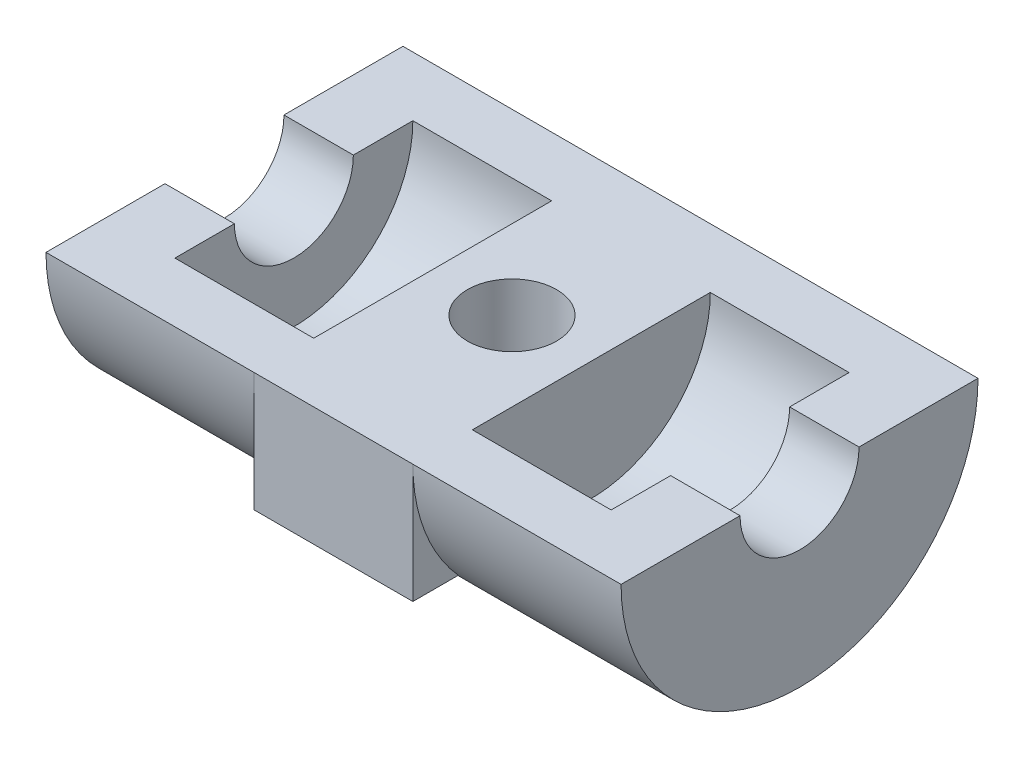
ISO-10303-21;
HEADER;
FILE_DESCRIPTION(('STEP AP214'),'2;1');
FILE_NAME('part.step','',(''),(''),'','','');
FILE_SCHEMA(('AUTOMOTIVE_DESIGN { 1 0 10303 214 1 1 1 1 }'));
ENDSEC;
DATA;
#1=APPLICATION_CONTEXT('core data for automotive mechanical design processes');
#2=APPLICATION_PROTOCOL_DEFINITION('international standard','automotive_design',2000,#1);
#3=PRODUCT_CONTEXT('',#1,'mechanical');
#4=PRODUCT('Part','Part','',(#3));
#5=PRODUCT_RELATED_PRODUCT_CATEGORY('part','',(#4));
#6=PRODUCT_DEFINITION_FORMATION('','',#4);
#7=PRODUCT_DEFINITION_CONTEXT('part definition',#1,'design');
#8=PRODUCT_DEFINITION('design','',#6,#7);
#9=PRODUCT_DEFINITION_SHAPE('','',#8);
#10=(LENGTH_UNIT() NAMED_UNIT(*) SI_UNIT(.MILLI.,.METRE.));
#11=(NAMED_UNIT(*) PLANE_ANGLE_UNIT() SI_UNIT($,.RADIAN.));
#12=(NAMED_UNIT(*) SI_UNIT($,.STERADIAN.) SOLID_ANGLE_UNIT());
#13=UNCERTAINTY_MEASURE_WITH_UNIT(LENGTH_MEASURE(1.E-05),#10,'distance_accuracy_value','');
#14=(GEOMETRIC_REPRESENTATION_CONTEXT(3) GLOBAL_UNCERTAINTY_ASSIGNED_CONTEXT((#13)) GLOBAL_UNIT_ASSIGNED_CONTEXT((#10,
#11,#12)) REPRESENTATION_CONTEXT('',''));
#15=CARTESIAN_POINT('',(0.,0.,0.));
#16=DIRECTION('',(0.,0.,1.));
#17=DIRECTION('',(1.,0.,0.));
#18=AXIS2_PLACEMENT_3D('',#15,#16,#17);
#19=CARTESIAN_POINT('',(-67.1094534539369,0.,-9.28447249655172));
#20=DIRECTION('',(0.,1.,0.));
#21=DIRECTION('',(0.,0.,1.));
#22=AXIS2_PLACEMENT_3D('',#19,#20,#21);
#23=PLANE('',#22);
#24=CARTESIAN_POINT('',(0.,0.,0.));
#25=DIRECTION('',(0.,1.,0.));
#26=DIRECTION('',(0.,0.,1.));
#27=AXIS2_PLACEMENT_3D('',#24,#25,#26);
#28=CIRCLE('',#27,2.25);
#29=CARTESIAN_POINT('',(0.,0.,2.25));
#30=VERTEX_POINT('',#29);
#31=EDGE_CURVE('E271',#30,#30,#28,.T.);
#32=ORIENTED_EDGE('',*,*,#31,.F.);
#33=EDGE_LOOP('',(#32));
#34=FACE_BOUND('',#33,.T.);
#35=DIRECTION('',(0.,0.,1.));
#36=VECTOR('',#35,1.);
#37=CARTESIAN_POINT('',(4.,0.,-9.));
#38=LINE('',#37,#36);
#39=CARTESIAN_POINT('',(4.,0.,-6.));
#40=VERTEX_POINT('',#39);
#41=CARTESIAN_POINT('',(4.,0.,6.));
#42=VERTEX_POINT('',#41);
#43=EDGE_CURVE('E268',#40,#42,#38,.T.);
#44=ORIENTED_EDGE('',*,*,#43,.F.);
#45=DIRECTION('',(-1.,0.,0.));
#46=VECTOR('',#45,1.);
#47=CARTESIAN_POINT('',(-39.0878378378379,0.,-6.));
#48=LINE('',#47,#46);
#49=CARTESIAN_POINT('',(11.,0.,-6.));
#50=VERTEX_POINT('',#49);
#51=EDGE_CURVE('E264',#40,#50,#48,.F.);
#52=ORIENTED_EDGE('',*,*,#51,.T.);
#53=DIRECTION('',(0.,0.,1.));
#54=VECTOR('',#53,1.);
#55=CARTESIAN_POINT('',(11.,0.,0.));
#56=LINE('',#55,#54);
#57=CARTESIAN_POINT('',(11.,0.,-3.));
#58=VERTEX_POINT('',#57);
#59=EDGE_CURVE('E259',#50,#58,#56,.T.);
#60=ORIENTED_EDGE('',*,*,#59,.T.);
#61=DIRECTION('',(-1.,0.,0.));
#62=VECTOR('',#61,1.);
#63=CARTESIAN_POINT('',(-39.0878378378379,0.,-3.));
#64=LINE('',#63,#62);
#65=CARTESIAN_POINT('',(14.5,0.,-3.));
#66=VERTEX_POINT('',#65);
#67=EDGE_CURVE('E251',#58,#66,#64,.F.);
#68=ORIENTED_EDGE('',*,*,#67,.T.);
#69=DIRECTION('',(0.,0.,-1.));
#70=VECTOR('',#69,1.);
#71=CARTESIAN_POINT('',(14.5,0.,0.));
#72=LINE('',#71,#70);
#73=CARTESIAN_POINT('',(14.5,0.,-9.));
#74=VERTEX_POINT('',#73);
#75=EDGE_CURVE('E242',#66,#74,#72,.T.);
#76=ORIENTED_EDGE('',*,*,#75,.T.);
#77=DIRECTION('',(-1.,0.,0.));
#78=VECTOR('',#77,1.);
#79=CARTESIAN_POINT('',(-39.0878378378379,0.,-9.));
#80=LINE('',#79,#78);
#81=CARTESIAN_POINT('',(4.,0.,-9.));
#82=VERTEX_POINT('',#81);
#83=EDGE_CURVE('E235',#74,#82,#80,.T.);
#84=ORIENTED_EDGE('',*,*,#83,.T.);
#85=DIRECTION('',(1.,0.,0.));
#86=VECTOR('',#85,1.);
#87=CARTESIAN_POINT('',(-4.,0.,-9.));
#88=LINE('',#87,#86);
#89=CARTESIAN_POINT('',(-4.,0.,-9.));
#90=VERTEX_POINT('',#89);
#91=EDGE_CURVE('E239',#90,#82,#88,.T.);
#92=ORIENTED_EDGE('',*,*,#91,.F.);
#93=CARTESIAN_POINT('',(-14.5,0.,-9.));
#94=VERTEX_POINT('',#93);
#95=EDGE_CURVE('E229',#90,#94,#80,.T.);
#96=ORIENTED_EDGE('',*,*,#95,.T.);
#97=DIRECTION('',(0.,0.,1.));
#98=VECTOR('',#97,1.);
#99=CARTESIAN_POINT('',(-14.5,0.,0.));
#100=LINE('',#99,#98);
#101=CARTESIAN_POINT('',(-14.5,0.,-3.));
#102=VERTEX_POINT('',#101);
#103=EDGE_CURVE('E87',#94,#102,#100,.T.);
#104=ORIENTED_EDGE('',*,*,#103,.T.);
#105=DIRECTION('',(-1.,0.,0.));
#106=VECTOR('',#105,1.);
#107=CARTESIAN_POINT('',(-39.0878378378379,0.,-3.));
#108=LINE('',#107,#106);
#109=CARTESIAN_POINT('',(-11.,0.,-3.));
#110=VERTEX_POINT('',#109);
#111=EDGE_CURVE('E220',#102,#110,#108,.F.);
#112=ORIENTED_EDGE('',*,*,#111,.T.);
#113=DIRECTION('',(0.,0.,-1.));
#114=VECTOR('',#113,1.);
#115=CARTESIAN_POINT('',(-11.,0.,0.));
#116=LINE('',#115,#114);
#117=CARTESIAN_POINT('',(-11.,0.,-6.));
#118=VERTEX_POINT('',#117);
#119=EDGE_CURVE('E209',#110,#118,#116,.T.);
#120=ORIENTED_EDGE('',*,*,#119,.T.);
#121=DIRECTION('',(-1.,0.,0.));
#122=VECTOR('',#121,1.);
#123=CARTESIAN_POINT('',(-39.0878378378379,0.,-6.));
#124=LINE('',#123,#122);
#125=CARTESIAN_POINT('',(-4.,0.,-6.));
#126=VERTEX_POINT('',#125);
#127=EDGE_CURVE('E204',#118,#126,#124,.F.);
#128=ORIENTED_EDGE('',*,*,#127,.T.);
#129=DIRECTION('',(0.,0.,1.));
#130=VECTOR('',#129,1.);
#131=CARTESIAN_POINT('',(-4.,0.,-9.));
#132=LINE('',#131,#130);
#133=CARTESIAN_POINT('',(-4.,0.,6.));
#134=VERTEX_POINT('',#133);
#135=EDGE_CURVE('E12',#126,#134,#132,.T.);
#136=ORIENTED_EDGE('',*,*,#135,.T.);
#137=DIRECTION('',(-1.,0.,0.));
#138=VECTOR('',#137,1.);
#139=CARTESIAN_POINT('',(-39.0878378378379,0.,6.));
#140=LINE('',#139,#138);
#141=CARTESIAN_POINT('',(-11.,0.,6.));
#142=VERTEX_POINT('',#141);
#143=EDGE_CURVE('E197',#134,#142,#140,.T.);
#144=ORIENTED_EDGE('',*,*,#143,.T.);
#145=CARTESIAN_POINT('',(-11.,0.,3.));
#146=VERTEX_POINT('',#145);
#147=EDGE_CURVE('E213',#142,#146,#116,.T.);
#148=ORIENTED_EDGE('',*,*,#147,.T.);
#149=DIRECTION('',(-1.,0.,0.));
#150=VECTOR('',#149,1.);
#151=CARTESIAN_POINT('',(-39.0878378378379,0.,3.));
#152=LINE('',#151,#150);
#153=CARTESIAN_POINT('',(-14.5,0.,3.));
#154=VERTEX_POINT('',#153);
#155=EDGE_CURVE('E216',#146,#154,#152,.T.);
#156=ORIENTED_EDGE('',*,*,#155,.T.);
#157=CARTESIAN_POINT('',(-14.5,0.,9.));
#158=VERTEX_POINT('',#157);
#159=EDGE_CURVE('E223',#154,#158,#100,.T.);
#160=ORIENTED_EDGE('',*,*,#159,.T.);
#161=DIRECTION('',(-1.,0.,0.));
#162=VECTOR('',#161,1.);
#163=CARTESIAN_POINT('',(-39.0878378378379,0.,9.));
#164=LINE('',#163,#162);
#165=CARTESIAN_POINT('',(-4.,0.,9.));
#166=VERTEX_POINT('',#165);
#167=EDGE_CURVE('E94',#158,#166,#164,.F.);
#168=ORIENTED_EDGE('',*,*,#167,.T.);
#169=DIRECTION('',(1.,0.,0.));
#170=VECTOR('',#169,1.);
#171=CARTESIAN_POINT('',(-4.,0.,9.));
#172=LINE('',#171,#170);
#173=CARTESIAN_POINT('',(4.,0.,9.));
#174=VERTEX_POINT('',#173);
#175=EDGE_CURVE('E234',#166,#174,#172,.T.);
#176=ORIENTED_EDGE('',*,*,#175,.T.);
#177=CARTESIAN_POINT('',(14.5,0.,9.));
#178=VERTEX_POINT('',#177);
#179=EDGE_CURVE('E230',#174,#178,#164,.F.);
#180=ORIENTED_EDGE('',*,*,#179,.T.);
#181=CARTESIAN_POINT('',(14.5,0.,3.));
#182=VERTEX_POINT('',#181);
#183=EDGE_CURVE('E246',#178,#182,#72,.T.);
#184=ORIENTED_EDGE('',*,*,#183,.T.);
#185=DIRECTION('',(-1.,0.,0.));
#186=VECTOR('',#185,1.);
#187=CARTESIAN_POINT('',(-39.0878378378379,0.,3.));
#188=LINE('',#187,#186);
#189=CARTESIAN_POINT('',(11.,0.,3.));
#190=VERTEX_POINT('',#189);
#191=EDGE_CURVE('E247',#182,#190,#188,.T.);
#192=ORIENTED_EDGE('',*,*,#191,.T.);
#193=CARTESIAN_POINT('',(11.,0.,6.));
#194=VERTEX_POINT('',#193);
#195=EDGE_CURVE('E255',#190,#194,#56,.T.);
#196=ORIENTED_EDGE('',*,*,#195,.T.);
#197=DIRECTION('',(-1.,0.,0.));
#198=VECTOR('',#197,1.);
#199=CARTESIAN_POINT('',(-39.0878378378379,0.,6.));
#200=LINE('',#199,#198);
#201=EDGE_CURVE('E260',#194,#42,#200,.T.);
#202=ORIENTED_EDGE('',*,*,#201,.T.);
#203=EDGE_LOOP('',(#44,#52,#60,#68,#76,#84,#92,#96,#104,#112,#120,#128,#136,#144,#148,#156,#160,
#168,#176,#180,#184,#192,#196,#202));
#204=FACE_BOUND('',#203,.T.);
#205=ADVANCED_FACE('F71',(#34,#204),#23,.T.);
#206=CARTESIAN_POINT('',(-39.0878378378379,0.,0.));
#207=DIRECTION('',(-1.,0.,0.));
#208=DIRECTION('',(0.,0.,1.));
#209=AXIS2_PLACEMENT_3D('',#206,#207,#208);
#210=CYLINDRICAL_SURFACE('',#209,6.);
#211=ORIENTED_EDGE('',*,*,#127,.F.);
#212=CARTESIAN_POINT('',(-11.,0.,0.));
#213=DIRECTION('',(-1.,0.,0.));
#214=DIRECTION('',(0.,0.,1.));
#215=AXIS2_PLACEMENT_3D('',#212,#213,#214);
#216=CIRCLE('',#215,6.);
#217=EDGE_CURVE('E200',#118,#142,#216,.T.);
#218=ORIENTED_EDGE('',*,*,#217,.T.);
#219=ORIENTED_EDGE('',*,*,#143,.F.);
#220=CARTESIAN_POINT('',(-4.,0.,0.));
#221=DIRECTION('',(1.,0.,0.));
#222=DIRECTION('',(0.,0.,-1.));
#223=AXIS2_PLACEMENT_3D('',#220,#221,#222);
#224=CIRCLE('',#223,6.);
#225=EDGE_CURVE('E186',#126,#134,#224,.F.);
#226=ORIENTED_EDGE('',*,*,#225,.F.);
#227=EDGE_LOOP('',(#211,#218,#219,#226));
#228=FACE_BOUND('',#227,.T.);
#229=ADVANCED_FACE('F198',(#228),#210,.F.);
#230=CARTESIAN_POINT('',(-39.0878378378379,0.,0.));
#231=DIRECTION('',(-1.,0.,0.));
#232=DIRECTION('',(0.,0.,1.));
#233=AXIS2_PLACEMENT_3D('',#230,#231,#232);
#234=CYLINDRICAL_SURFACE('',#233,9.);
#235=CARTESIAN_POINT('',(0.,-8.71421252896669,-2.25));
#236=CARTESIAN_POINT('',(0.124245675833919,-8.71421490079074,-2.24999647073377));
#237=CARTESIAN_POINT('',(0.24853040881067,-8.71689875413137,-2.23967362094789));
#238=CARTESIAN_POINT('',(0.493530820356159,-8.72731675793308,-2.19872081291741));
#239=CARTESIAN_POINT('',(0.614244379021367,-8.73505384759467,-2.16807903606789));
#240=CARTESIAN_POINT('',(0.848523184368464,-8.75464852136535,-2.08754207966884));
#241=CARTESIAN_POINT('',(0.962097439847137,-8.76650078421412,-2.03767175506904));
#242=CARTESIAN_POINT('',(1.17927976728589,-8.79298372825883,-1.92016902713525));
#243=CARTESIAN_POINT('',(1.2828874158722,-8.8076145274064,-1.85253586970462));
#244=CARTESIAN_POINT('',(1.47947548073599,-8.83836644720062,-1.69983758458069));
#245=CARTESIAN_POINT('',(1.57220424031504,-8.85451137860731,-1.61445319893365));
#246=CARTESIAN_POINT('',(1.74218525492431,-8.88626587963764,-1.4293638576906));
#247=CARTESIAN_POINT('',(1.81943606305957,-8.90187539909749,-1.32965756476228));
#248=CARTESIAN_POINT('',(1.95729792086815,-8.93106373968524,-1.11703068097106));
#249=CARTESIAN_POINT('',(2.01766174934532,-8.94461118660533,-1.00394511857561));
#250=CARTESIAN_POINT('',(2.11842867973777,-8.96787730733385,-0.768836865863486));
#251=CARTESIAN_POINT('',(2.15883472672396,-8.9775965460091,-0.646815497212746));
#252=CARTESIAN_POINT('',(2.21773305112073,-8.99194282963362,-0.399922882878745));
#253=CARTESIAN_POINT('',(2.23665267989392,-8.99666904459882,-0.275159447594077));
#254=CARTESIAN_POINT('',(2.253382541348,-9.00084234696568,-0.024145937336492));
#255=CARTESIAN_POINT('',(2.25119589498864,-9.00029021487034,0.102103915084262));
#256=CARTESIAN_POINT('',(2.22608263477487,-8.9940428545818,0.349542556137872));
#257=CARTESIAN_POINT('',(2.20361730745153,-8.98846202106784,0.470781485102401));
#258=CARTESIAN_POINT('',(2.13932585695635,-8.97291752872371,0.707711056680794));
#259=CARTESIAN_POINT('',(2.09749870316033,-8.96295363658607,0.823401403583486));
#260=CARTESIAN_POINT('',(1.99529768638164,-8.93958758730796,1.04716508287906));
#261=CARTESIAN_POINT('',(1.93475965980443,-8.92615517725509,1.15516014697463));
#262=CARTESIAN_POINT('',(1.79697988879537,-8.89730913428722,1.3596201502661));
#263=CARTESIAN_POINT('',(1.71973523829544,-8.88189515687385,1.45608307894239));
#264=CARTESIAN_POINT('',(1.54826213221587,-8.85027342392421,1.63749157894115));
#265=CARTESIAN_POINT('',(1.45363059688703,-8.83405547572767,1.72205477791919));
#266=CARTESIAN_POINT('',(1.25136002381375,-8.80303539165594,1.8741968459168));
#267=CARTESIAN_POINT('',(1.14372037845801,-8.7882333219746,1.94177492110356));
#268=CARTESIAN_POINT('',(0.917738969266025,-8.76168447146387,2.05827329030082));
#269=CARTESIAN_POINT('',(0.799347842718477,-8.74995285345306,2.10710152568351));
#270=CARTESIAN_POINT('',(0.555673078730841,-8.73106776133802,2.18404264643186));
#271=CARTESIAN_POINT('',(0.430390922413863,-8.7239133075846,2.21215996474439));
#272=CARTESIAN_POINT('',(0.180036448623073,-8.71519820406711,2.24624667479933));
#273=CARTESIAN_POINT('',(0.0550459859930781,-8.7134948007924,2.25278142652721));
#274=CARTESIAN_POINT('',(-0.194239742926729,-8.71548609028223,2.24506529146364));
#275=CARTESIAN_POINT('',(-0.318535072154498,-8.7191802861327,2.23081631806482));
#276=CARTESIAN_POINT('',(-0.560802838453716,-8.73141373786481,2.18243291754443));
#277=CARTESIAN_POINT('',(-0.678845453912279,-8.73987273218278,2.14862766145371));
#278=CARTESIAN_POINT('',(-0.907588312067995,-8.76060646436524,2.06245627350342));
#279=CARTESIAN_POINT('',(-1.01828768315021,-8.77288165421767,2.01008794294125));
#280=CARTESIAN_POINT('',(-1.23159715008021,-8.8001652338596,1.88709360114294));
#281=CARTESIAN_POINT('',(-1.33400595603868,-8.8152225174652,1.81612957845208));
#282=CARTESIAN_POINT('',(-1.52566952652133,-8.84625374764001,1.65838565910252));
#283=CARTESIAN_POINT('',(-1.6149221249851,-8.86222784455476,1.57160316331224));
#284=CARTESIAN_POINT('',(-1.78002993831383,-8.89377662728596,1.38209112221564));
#285=CARTESIAN_POINT('',(-1.85549405629392,-8.90933131855692,1.27901689319608));
#286=CARTESIAN_POINT('',(-1.98804228025613,-8.93787494952321,1.06133103606302));
#287=CARTESIAN_POINT('',(-2.04512734494739,-8.95086402303554,0.946720010154579));
#288=CARTESIAN_POINT('',(-2.13880143107514,-8.97273104164492,0.710005953894953));
#289=CARTESIAN_POINT('',(-2.17553785594116,-8.98163847020168,0.587964107312734));
#290=CARTESIAN_POINT('',(-2.22791430114757,-8.9944676405621,0.339186960717315));
#291=CARTESIAN_POINT('',(-2.24355839286514,-8.99839034454079,0.21245257134279));
#292=CARTESIAN_POINT('',(-2.25307707654496,-9.00076881169814,-0.0384379344974771));
#293=CARTESIAN_POINT('',(-2.24752884546467,-8.99936952479974,-0.162571110673549));
#294=CARTESIAN_POINT('',(-2.21614238858771,-8.99158267029247,-0.408076866933189));
#295=CARTESIAN_POINT('',(-2.19030476622037,-8.9851952510363,-0.52944952900709));
#296=CARTESIAN_POINT('',(-2.11938250551556,-8.9681722392125,-0.765384830200742));
#297=CARTESIAN_POINT('',(-2.07440223004265,-8.95755970130383,-0.879980612806942));
#298=CARTESIAN_POINT('',(-1.96656619720596,-8.9332040005573,-1.10006336934365));
#299=CARTESIAN_POINT('',(-1.90370818649141,-8.91946044312204,-1.20554919284767));
#300=CARTESIAN_POINT('',(-1.7601407235087,-8.88991311780646,-1.40715433895243));
#301=CARTESIAN_POINT('',(-1.67903967846638,-8.87406788118745,-1.50298872367126));
#302=CARTESIAN_POINT('',(-1.50204858305097,-8.84228960378677,-1.67988379561538));
#303=CARTESIAN_POINT('',(-1.40615478874988,-8.8263565417643,-1.76094073142233));
#304=CARTESIAN_POINT('',(-1.20014681807371,-8.7958682065238,-1.90746455956162));
#305=CARTESIAN_POINT('',(-1.08980072242818,-8.781344182649,-1.97261239368685));
#306=CARTESIAN_POINT('',(-0.859375147781657,-8.75573899863363,-2.08333551731731));
#307=CARTESIAN_POINT('',(-0.739302826288845,-8.74465533524731,-2.12892504694234));
#308=CARTESIAN_POINT('',(-0.516201723370889,-8.72891794689159,-2.19245068928476));
#309=CARTESIAN_POINT('',(-0.414240380131192,-8.72344491757872,-2.21398463384298));
#310=CARTESIAN_POINT('',(-0.208195044755202,-8.71609136810895,-2.24276015828648));
#311=CARTESIAN_POINT('',(-0.104111234450095,-8.71421054150492,-2.25000295733644));
#312=CARTESIAN_POINT('',(0.,-8.71421252896669,-2.25));
#313=B_SPLINE_CURVE_WITH_KNOTS('',3,(#235,#236,#237,#238,#239,#240,#241,#242,#243,#244,#245,
#246,#247,#248,#249,#250,#251,#252,#253,#254,#255,#256,#257,#258,#259,#260,#261,#262,#263,#264,
#265,#266,#267,#268,#269,#270,#271,#272,#273,#274,#275,#276,#277,#278,#279,#280,#281,#282,#283,
#284,#285,#286,#287,#288,#289,#290,#291,#292,#293,#294,#295,#296,#297,#298,#299,#300,#301,#302,
#303,#304,#305,#306,#307,#308,#309,#310,#311,#312),.UNSPECIFIED.,.T.,.F.,(4,2,2,2,2,2,2,2,2,2,2,
2,2,2,2,2,2,2,2,2,2,2,2,2,2,2,2,2,2,2,2,2,2,2,2,2,2,2,4),(0.,0.372354697562523,0.7449261672858,
1.11701765444942,1.48912494079931,1.86861558773679,2.2481416933188,2.63296346758128,
3.01772843862383,3.39469875895812,3.77161333799418,4.14016436420052,4.50873501052307,
4.88063586829,5.25260146922022,5.6346341991472,6.01668478079822,6.40058788807562,
6.78440880116593,7.15809217287784,7.53174114469872,7.89927664512737,8.26685569283726,
8.64164561277692,9.0164971700099,9.40072797873237,9.78493874152048,10.1663286553069,
10.5476449402258,10.9186510151916,11.2896460564373,11.6586438890819,12.0276882516872,
12.4055738692831,12.7835552841341,13.1685882956202,13.5533404923751,13.8653804446715,
14.1773937759712),.UNSPECIFIED.);
#314=CARTESIAN_POINT('',(0.,-8.71421252896669,-2.25));
#315=VERTEX_POINT('',#314);
#316=EDGE_CURVE('E192',#315,#315,#313,.T.);
#317=ORIENTED_EDGE('',*,*,#316,.F.);
#318=EDGE_LOOP('',(#317));
#319=FACE_BOUND('',#318,.T.);
#320=ORIENTED_EDGE('',*,*,#83,.F.);
#321=CARTESIAN_POINT('',(14.5,0.,0.));
#322=DIRECTION('',(-1.,0.,0.));
#323=DIRECTION('',(0.,0.,1.));
#324=AXIS2_PLACEMENT_3D('',#321,#322,#323);
#325=CIRCLE('',#324,9.);
#326=EDGE_CURVE('E319',#74,#178,#325,.T.);
#327=ORIENTED_EDGE('',*,*,#326,.T.);
#328=ORIENTED_EDGE('',*,*,#179,.F.);
#329=CARTESIAN_POINT('',(4.,0.,0.));
#330=DIRECTION('',(1.,0.,0.));
#331=DIRECTION('',(0.,0.,-1.));
#332=AXIS2_PLACEMENT_3D('',#329,#330,#331);
#333=CIRCLE('',#332,9.);
#334=CARTESIAN_POINT('',(4.,-6.,6.70820393249937));
#335=VERTEX_POINT('',#334);
#336=EDGE_CURVE('E435',#174,#335,#333,.T.);
#337=ORIENTED_EDGE('',*,*,#336,.T.);
#338=DIRECTION('',(-1.,0.,0.));
#339=VECTOR('',#338,1.);
#340=CARTESIAN_POINT('',(-39.0878378378379,-6.,6.70820393249937));
#341=LINE('',#340,#339);
#342=CARTESIAN_POINT('',(-4.,-6.,6.70820393249937));
#343=VERTEX_POINT('',#342);
#344=EDGE_CURVE('E309',#335,#343,#341,.T.);
#345=ORIENTED_EDGE('',*,*,#344,.T.);
#346=CARTESIAN_POINT('',(-4.,0.,0.));
#347=DIRECTION('',(1.,0.,0.));
#348=DIRECTION('',(0.,0.,-1.));
#349=AXIS2_PLACEMENT_3D('',#346,#347,#348);
#350=CIRCLE('',#349,9.);
#351=EDGE_CURVE('E80',#166,#343,#350,.T.);
#352=ORIENTED_EDGE('',*,*,#351,.F.);
#353=ORIENTED_EDGE('',*,*,#167,.F.);
#354=CARTESIAN_POINT('',(-14.5,0.,0.));
#355=DIRECTION('',(-1.,0.,0.));
#356=DIRECTION('',(0.,0.,1.));
#357=AXIS2_PLACEMENT_3D('',#354,#355,#356);
#358=CIRCLE('',#357,9.);
#359=EDGE_CURVE('E316',#94,#158,#358,.T.);
#360=ORIENTED_EDGE('',*,*,#359,.F.);
#361=ORIENTED_EDGE('',*,*,#95,.F.);
#362=CARTESIAN_POINT('',(-4.,-6.,-6.70820393249937));
#363=VERTEX_POINT('',#362);
#364=EDGE_CURVE('E431',#363,#90,#350,.T.);
#365=ORIENTED_EDGE('',*,*,#364,.F.);
#366=DIRECTION('',(-1.,0.,0.));
#367=VECTOR('',#366,1.);
#368=CARTESIAN_POINT('',(-39.0878378378379,-6.,-6.70820393249937));
#369=LINE('',#368,#367);
#370=CARTESIAN_POINT('',(4.,-6.,-6.70820393249937));
#371=VERTEX_POINT('',#370);
#372=EDGE_CURVE('E297',#363,#371,#369,.F.);
#373=ORIENTED_EDGE('',*,*,#372,.T.);
#374=EDGE_CURVE('E345',#371,#82,#333,.T.);
#375=ORIENTED_EDGE('',*,*,#374,.T.);
#376=EDGE_LOOP('',(#320,#327,#328,#337,#345,#352,#353,#360,#361,#365,#373,#375));
#377=FACE_BOUND('',#376,.T.);
#378=ADVANCED_FACE('F354',(#319,#377),#234,.T.);
#379=ORIENTED_EDGE('',*,*,#51,.F.);
#380=CARTESIAN_POINT('',(4.,0.,0.));
#381=DIRECTION('',(1.,0.,0.));
#382=DIRECTION('',(0.,0.,-1.));
#383=AXIS2_PLACEMENT_3D('',#380,#381,#382);
#384=CIRCLE('',#383,6.);
#385=EDGE_CURVE('E193',#40,#42,#384,.F.);
#386=ORIENTED_EDGE('',*,*,#385,.T.);
#387=ORIENTED_EDGE('',*,*,#201,.F.);
#388=CARTESIAN_POINT('',(11.,0.,0.));
#389=DIRECTION('',(-1.,0.,0.));
#390=DIRECTION('',(0.,0.,1.));
#391=AXIS2_PLACEMENT_3D('',#388,#389,#390);
#392=CIRCLE('',#391,6.);
#393=EDGE_CURVE('E331',#50,#194,#392,.T.);
#394=ORIENTED_EDGE('',*,*,#393,.F.);
#395=EDGE_LOOP('',(#379,#386,#387,#394));
#396=FACE_BOUND('',#395,.T.);
#397=ADVANCED_FACE('F393',(#396),#210,.F.);
#398=CARTESIAN_POINT('',(-14.5,9.,0.));
#399=DIRECTION('',(1.,0.,0.));
#400=DIRECTION('',(0.,0.,-1.));
#401=AXIS2_PLACEMENT_3D('',#398,#399,#400);
#402=PLANE('',#401);
#403=ORIENTED_EDGE('',*,*,#103,.F.);
#404=ORIENTED_EDGE('',*,*,#359,.T.);
#405=ORIENTED_EDGE('',*,*,#159,.F.);
#406=CARTESIAN_POINT('',(-14.5,0.,0.));
#407=DIRECTION('',(-1.,0.,0.));
#408=DIRECTION('',(0.,0.,1.));
#409=AXIS2_PLACEMENT_3D('',#406,#407,#408);
#410=CIRCLE('',#409,3.);
#411=EDGE_CURVE('E341',#102,#154,#410,.T.);
#412=ORIENTED_EDGE('',*,*,#411,.F.);
#413=EDGE_LOOP('',(#403,#404,#405,#412));
#414=FACE_BOUND('',#413,.T.);
#415=ADVANCED_FACE('F73',(#414),#402,.F.);
#416=CARTESIAN_POINT('',(-39.0878378378379,0.,0.));
#417=DIRECTION('',(-1.,0.,0.));
#418=DIRECTION('',(0.,0.,1.));
#419=AXIS2_PLACEMENT_3D('',#416,#417,#418);
#420=CYLINDRICAL_SURFACE('',#419,3.);
#421=ORIENTED_EDGE('',*,*,#111,.F.);
#422=ORIENTED_EDGE('',*,*,#411,.T.);
#423=ORIENTED_EDGE('',*,*,#155,.F.);
#424=CARTESIAN_POINT('',(-11.,0.,0.));
#425=DIRECTION('',(-1.,0.,0.));
#426=DIRECTION('',(0.,0.,1.));
#427=AXIS2_PLACEMENT_3D('',#424,#425,#426);
#428=CIRCLE('',#427,3.);
#429=EDGE_CURVE('E337',#110,#146,#428,.T.);
#430=ORIENTED_EDGE('',*,*,#429,.F.);
#431=EDGE_LOOP('',(#421,#422,#423,#430));
#432=FACE_BOUND('',#431,.T.);
#433=ADVANCED_FACE('F407',(#432),#420,.F.);
#434=CARTESIAN_POINT('',(-11.,3.,0.));
#435=DIRECTION('',(-1.,0.,0.));
#436=DIRECTION('',(0.,0.,1.));
#437=AXIS2_PLACEMENT_3D('',#434,#435,#436);
#438=PLANE('',#437);
#439=ORIENTED_EDGE('',*,*,#147,.F.);
#440=ORIENTED_EDGE('',*,*,#217,.F.);
#441=ORIENTED_EDGE('',*,*,#119,.F.);
#442=ORIENTED_EDGE('',*,*,#429,.T.);
#443=EDGE_LOOP('',(#439,#440,#441,#442));
#444=FACE_BOUND('',#443,.T.);
#445=ADVANCED_FACE('F425',(#444),#438,.F.);
#446=CARTESIAN_POINT('',(11.,3.,0.));
#447=DIRECTION('',(1.,0.,0.));
#448=DIRECTION('',(0.,0.,-1.));
#449=AXIS2_PLACEMENT_3D('',#446,#447,#448);
#450=PLANE('',#449);
#451=ORIENTED_EDGE('',*,*,#59,.F.);
#452=ORIENTED_EDGE('',*,*,#393,.T.);
#453=ORIENTED_EDGE('',*,*,#195,.F.);
#454=CARTESIAN_POINT('',(11.,0.,0.));
#455=DIRECTION('',(-1.,0.,0.));
#456=DIRECTION('',(0.,0.,1.));
#457=AXIS2_PLACEMENT_3D('',#454,#455,#456);
#458=CIRCLE('',#457,3.);
#459=EDGE_CURVE('E327',#58,#190,#458,.T.);
#460=ORIENTED_EDGE('',*,*,#459,.F.);
#461=EDGE_LOOP('',(#451,#452,#453,#460));
#462=FACE_BOUND('',#461,.T.);
#463=ADVANCED_FACE('F413',(#462),#450,.F.);
#464=CARTESIAN_POINT('',(-39.0878378378379,0.,0.));
#465=DIRECTION('',(-1.,0.,0.));
#466=DIRECTION('',(0.,0.,1.));
#467=AXIS2_PLACEMENT_3D('',#464,#465,#466);
#468=CYLINDRICAL_SURFACE('',#467,3.);
#469=ORIENTED_EDGE('',*,*,#67,.F.);
#470=ORIENTED_EDGE('',*,*,#459,.T.);
#471=ORIENTED_EDGE('',*,*,#191,.F.);
#472=CARTESIAN_POINT('',(14.5,0.,0.));
#473=DIRECTION('',(-1.,0.,0.));
#474=DIRECTION('',(0.,0.,1.));
#475=AXIS2_PLACEMENT_3D('',#472,#473,#474);
#476=CIRCLE('',#475,3.);
#477=EDGE_CURVE('E323',#66,#182,#476,.T.);
#478=ORIENTED_EDGE('',*,*,#477,.F.);
#479=EDGE_LOOP('',(#469,#470,#471,#478));
#480=FACE_BOUND('',#479,.T.);
#481=ADVANCED_FACE('F446',(#480),#468,.F.);
#482=CARTESIAN_POINT('',(14.5,9.,0.));
#483=DIRECTION('',(-1.,0.,0.));
#484=DIRECTION('',(0.,0.,1.));
#485=AXIS2_PLACEMENT_3D('',#482,#483,#484);
#486=PLANE('',#485);
#487=ORIENTED_EDGE('',*,*,#183,.F.);
#488=ORIENTED_EDGE('',*,*,#326,.F.);
#489=ORIENTED_EDGE('',*,*,#75,.F.);
#490=ORIENTED_EDGE('',*,*,#477,.T.);
#491=EDGE_LOOP('',(#487,#488,#489,#490));
#492=FACE_BOUND('',#491,.T.);
#493=ADVANCED_FACE('F362',(#492),#486,.F.);
#494=CARTESIAN_POINT('',(0.,10.,0.));
#495=DIRECTION('',(0.,-1.,0.));
#496=DIRECTION('',(0.,0.,-1.));
#497=AXIS2_PLACEMENT_3D('',#494,#495,#496);
#498=CYLINDRICAL_SURFACE('',#497,2.25);
#499=ORIENTED_EDGE('',*,*,#316,.T.);
#500=EDGE_LOOP('',(#499));
#501=FACE_BOUND('',#500,.T.);
#502=ORIENTED_EDGE('',*,*,#31,.T.);
#503=EDGE_LOOP('',(#502));
#504=FACE_BOUND('',#503,.T.);
#505=ADVANCED_FACE('F357',(#501,#504),#498,.F.);
#506=CARTESIAN_POINT('',(-4.,6.,-9.));
#507=DIRECTION('',(0.,0.,-1.));
#508=DIRECTION('',(-1.,0.,0.));
#509=AXIS2_PLACEMENT_3D('',#506,#507,#508);
#510=PLANE('',#509);
#511=DIRECTION('',(0.,-1.,0.));
#512=VECTOR('',#511,1.);
#513=CARTESIAN_POINT('',(-4.,6.,-9.));
#514=LINE('',#513,#512);
#515=CARTESIAN_POINT('',(-4.,-6.,-9.));
#516=VERTEX_POINT('',#515);
#517=EDGE_CURVE('E294',#90,#516,#514,.T.);
#518=ORIENTED_EDGE('',*,*,#517,.F.);
#519=ORIENTED_EDGE('',*,*,#91,.T.);
#520=DIRECTION('',(0.,-1.,0.));
#521=VECTOR('',#520,1.);
#522=CARTESIAN_POINT('',(4.,6.,-9.));
#523=LINE('',#522,#521);
#524=CARTESIAN_POINT('',(4.,-6.,-9.));
#525=VERTEX_POINT('',#524);
#526=EDGE_CURVE('E293',#82,#525,#523,.T.);
#527=ORIENTED_EDGE('',*,*,#526,.T.);
#528=DIRECTION('',(1.,0.,0.));
#529=VECTOR('',#528,1.);
#530=CARTESIAN_POINT('',(-4.,-6.,-9.));
#531=LINE('',#530,#529);
#532=EDGE_CURVE('E275',#516,#525,#531,.T.);
#533=ORIENTED_EDGE('',*,*,#532,.F.);
#534=EDGE_LOOP('',(#518,#519,#527,#533));
#535=FACE_BOUND('',#534,.T.);
#536=ADVANCED_FACE('F361',(#535),#510,.T.);
#537=CARTESIAN_POINT('',(-4.,6.,9.));
#538=DIRECTION('',(0.,0.,-1.));
#539=DIRECTION('',(-1.,0.,0.));
#540=AXIS2_PLACEMENT_3D('',#537,#538,#539);
#541=PLANE('',#540);
#542=ORIENTED_EDGE('',*,*,#175,.F.);
#543=DIRECTION('',(0.,-1.,0.));
#544=VECTOR('',#543,1.);
#545=CARTESIAN_POINT('',(-4.,6.,9.));
#546=LINE('',#545,#544);
#547=CARTESIAN_POINT('',(-4.,-6.,9.));
#548=VERTEX_POINT('',#547);
#549=EDGE_CURVE('E298',#166,#548,#546,.T.);
#550=ORIENTED_EDGE('',*,*,#549,.T.);
#551=DIRECTION('',(1.,0.,0.));
#552=VECTOR('',#551,1.);
#553=CARTESIAN_POINT('',(-4.,-6.,9.));
#554=LINE('',#553,#552);
#555=CARTESIAN_POINT('',(4.,-6.,9.));
#556=VERTEX_POINT('',#555);
#557=EDGE_CURVE('E284',#548,#556,#554,.T.);
#558=ORIENTED_EDGE('',*,*,#557,.T.);
#559=DIRECTION('',(0.,-1.,0.));
#560=VECTOR('',#559,1.);
#561=CARTESIAN_POINT('',(4.,6.,9.));
#562=LINE('',#561,#560);
#563=EDGE_CURVE('E301',#174,#556,#562,.T.);
#564=ORIENTED_EDGE('',*,*,#563,.F.);
#565=EDGE_LOOP('',(#542,#550,#558,#564));
#566=FACE_BOUND('',#565,.T.);
#567=ADVANCED_FACE('F366',(#566),#541,.F.);
#568=CARTESIAN_POINT('',(4.,6.,-9.));
#569=DIRECTION('',(1.,0.,0.));
#570=DIRECTION('',(0.,0.,-1.));
#571=AXIS2_PLACEMENT_3D('',#568,#569,#570);
#572=PLANE('',#571);
#573=ORIENTED_EDGE('',*,*,#385,.F.);
#574=ORIENTED_EDGE('',*,*,#43,.T.);
#575=EDGE_LOOP('',(#573,#574));
#576=FACE_BOUND('',#575,.T.);
#577=ADVANCED_FACE('F373',(#576),#572,.T.);
#578=CARTESIAN_POINT('',(-4.,6.,-9.));
#579=DIRECTION('',(1.,0.,0.));
#580=DIRECTION('',(0.,0.,-1.));
#581=AXIS2_PLACEMENT_3D('',#578,#579,#580);
#582=PLANE('',#581);
#583=ORIENTED_EDGE('',*,*,#135,.F.);
#584=ORIENTED_EDGE('',*,*,#225,.T.);
#585=EDGE_LOOP('',(#583,#584));
#586=FACE_BOUND('',#585,.T.);
#587=ADVANCED_FACE('F188',(#586),#582,.F.);
#588=ORIENTED_EDGE('',*,*,#374,.F.);
#589=DIRECTION('',(0.,0.,1.));
#590=VECTOR('',#589,1.);
#591=CARTESIAN_POINT('',(4.,-6.,-9.));
#592=LINE('',#591,#590);
#593=EDGE_CURVE('E280',#525,#371,#592,.T.);
#594=ORIENTED_EDGE('',*,*,#593,.F.);
#595=ORIENTED_EDGE('',*,*,#526,.F.);
#596=EDGE_LOOP('',(#588,#594,#595));
#597=FACE_BOUND('',#596,.T.);
#598=ADVANCED_FACE('F368',(#597),#572,.T.);
#599=DIRECTION('',(0.,0.,1.));
#600=VECTOR('',#599,1.);
#601=CARTESIAN_POINT('',(-4.,-6.,-9.));
#602=LINE('',#601,#600);
#603=EDGE_CURVE('E289',#516,#363,#602,.T.);
#604=ORIENTED_EDGE('',*,*,#603,.T.);
#605=ORIENTED_EDGE('',*,*,#364,.T.);
#606=ORIENTED_EDGE('',*,*,#517,.T.);
#607=EDGE_LOOP('',(#604,#605,#606));
#608=FACE_BOUND('',#607,.T.);
#609=ADVANCED_FACE('F371',(#608),#582,.F.);
#610=CARTESIAN_POINT('',(0.,-6.,0.));
#611=DIRECTION('',(0.,-1.,0.));
#612=DIRECTION('',(0.,0.,-1.));
#613=AXIS2_PLACEMENT_3D('',#610,#611,#612);
#614=PLANE('',#613);
#615=ORIENTED_EDGE('',*,*,#372,.F.);
#616=ORIENTED_EDGE('',*,*,#603,.F.);
#617=ORIENTED_EDGE('',*,*,#532,.T.);
#618=ORIENTED_EDGE('',*,*,#593,.T.);
#619=EDGE_LOOP('',(#615,#616,#617,#618));
#620=FACE_BOUND('',#619,.T.);
#621=ADVANCED_FACE('F380',(#620),#614,.T.);
#622=ORIENTED_EDGE('',*,*,#549,.F.);
#623=ORIENTED_EDGE('',*,*,#351,.T.);
#624=EDGE_CURVE('E288',#343,#548,#602,.T.);
#625=ORIENTED_EDGE('',*,*,#624,.T.);
#626=EDGE_LOOP('',(#622,#623,#625));
#627=FACE_BOUND('',#626,.T.);
#628=ADVANCED_FACE('F382',(#627),#582,.F.);
#629=ORIENTED_EDGE('',*,*,#336,.F.);
#630=ORIENTED_EDGE('',*,*,#563,.T.);
#631=EDGE_CURVE('E279',#335,#556,#592,.T.);
#632=ORIENTED_EDGE('',*,*,#631,.F.);
#633=EDGE_LOOP('',(#629,#630,#632));
#634=FACE_BOUND('',#633,.T.);
#635=ADVANCED_FACE('F374',(#634),#572,.T.);
#636=ORIENTED_EDGE('',*,*,#344,.F.);
#637=ORIENTED_EDGE('',*,*,#631,.T.);
#638=ORIENTED_EDGE('',*,*,#557,.F.);
#639=ORIENTED_EDGE('',*,*,#624,.F.);
#640=EDGE_LOOP('',(#636,#637,#638,#639));
#641=FACE_BOUND('',#640,.T.);
#642=ADVANCED_FACE('F383',(#641),#614,.T.);
#643=CLOSED_SHELL('',(#205,#229,#378,#397,#415,#433,#445,#463,#481,#493,#505,#536,#567,#577,
#587,#598,#609,#621,#628,#635,#642));
#644=MANIFOLD_SOLID_BREP('B2',#643);
#645=ADVANCED_BREP_SHAPE_REPRESENTATION('',(#18,#644),#14);
#646=SHAPE_DEFINITION_REPRESENTATION(#9,#645);
ENDSEC;
END-ISO-10303-21;
